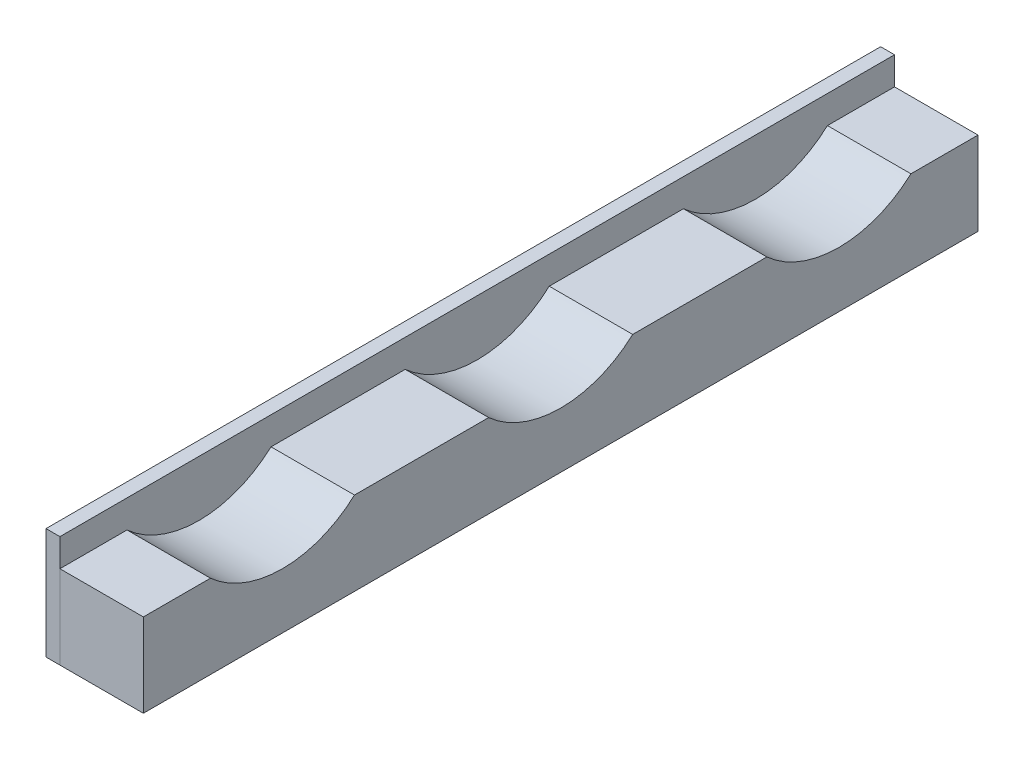
ISO-10303-21;
HEADER;
FILE_DESCRIPTION(('STEP AP214'),'2;1');
FILE_NAME('part.step','',(''),(''),'','','');
FILE_SCHEMA(('AUTOMOTIVE_DESIGN { 1 0 10303 214 1 1 1 1 }'));
ENDSEC;
DATA;
#1=APPLICATION_CONTEXT('core data for automotive mechanical design processes');
#2=APPLICATION_PROTOCOL_DEFINITION('international standard','automotive_design',2000,#1);
#3=PRODUCT_CONTEXT('',#1,'mechanical');
#4=PRODUCT('Part','Part','',(#3));
#5=PRODUCT_RELATED_PRODUCT_CATEGORY('part','',(#4));
#6=PRODUCT_DEFINITION_FORMATION('','',#4);
#7=PRODUCT_DEFINITION_CONTEXT('part definition',#1,'design');
#8=PRODUCT_DEFINITION('design','',#6,#7);
#9=PRODUCT_DEFINITION_SHAPE('','',#8);
#10=(LENGTH_UNIT() NAMED_UNIT(*) SI_UNIT(.MILLI.,.METRE.));
#11=(NAMED_UNIT(*) PLANE_ANGLE_UNIT() SI_UNIT($,.RADIAN.));
#12=(NAMED_UNIT(*) SI_UNIT($,.STERADIAN.) SOLID_ANGLE_UNIT());
#13=UNCERTAINTY_MEASURE_WITH_UNIT(LENGTH_MEASURE(1.E-05),#10,'distance_accuracy_value','');
#14=(GEOMETRIC_REPRESENTATION_CONTEXT(3) GLOBAL_UNCERTAINTY_ASSIGNED_CONTEXT((#13)) GLOBAL_UNIT_ASSIGNED_CONTEXT((#10,
#11,#12)) REPRESENTATION_CONTEXT('',''));
#15=CARTESIAN_POINT('',(0.,0.,0.));
#16=DIRECTION('',(0.,0.,1.));
#17=DIRECTION('',(1.,0.,0.));
#18=AXIS2_PLACEMENT_3D('',#15,#16,#17);
#19=CARTESIAN_POINT('',(22.,69.99,0.00999999999999446));
#20=DIRECTION('',(1.,0.,0.));
#21=DIRECTION('',(0.,0.,-1.));
#22=AXIS2_PLACEMENT_3D('',#19,#20,#21);
#23=PLANE('',#22);
#24=DIRECTION('',(0.,0.,-1.));
#25=VECTOR('',#24,1.);
#26=CARTESIAN_POINT('',(22.,100.,-99.9999999999997));
#27=LINE('',#26,#25);
#28=CARTESIAN_POINT('',(22.,100.,-75.8843582110894));
#29=VERTEX_POINT('',#28);
#30=CARTESIAN_POINT('',(22.,100.,-124.11564178891));
#31=VERTEX_POINT('',#30);
#32=EDGE_CURVE('P0_E104',#29,#31,#27,.T.);
#33=ORIENTED_EDGE('',*,*,#32,.F.);
#34=CARTESIAN_POINT('',(22.,128.5,-49.9999999999999));
#35=DIRECTION('',(1.,0.,0.));
#36=DIRECTION('',(0.,1.,0.));
#37=AXIS2_PLACEMENT_3D('',#34,#35,#36);
#38=CIRCLE('',#37,38.5);
#39=CARTESIAN_POINT('',(22.,100.,-24.1156417889104));
#40=VERTEX_POINT('',#39);
#41=EDGE_CURVE('P0_E21',#40,#29,#38,.T.);
#42=ORIENTED_EDGE('',*,*,#41,.F.);
#43=DIRECTION('',(0.,0.,-1.));
#44=VECTOR('',#43,1.);
#45=CARTESIAN_POINT('',(22.,100.,-12.0578208944552));
#46=LINE('',#45,#44);
#47=CARTESIAN_POINT('',(22.,100.,0.));
#48=VERTEX_POINT('',#47);
#49=EDGE_CURVE('P0_E90',#48,#40,#46,.T.);
#50=ORIENTED_EDGE('',*,*,#49,.F.);
#51=DIRECTION('',(0.,1.,0.));
#52=VECTOR('',#51,1.);
#53=CARTESIAN_POINT('',(22.,85.,0.));
#54=LINE('',#53,#52);
#55=CARTESIAN_POINT('',(22.,70.,0.));
#56=VERTEX_POINT('',#55);
#57=EDGE_CURVE('P0_E124',#56,#48,#54,.T.);
#58=ORIENTED_EDGE('',*,*,#57,.F.);
#59=DIRECTION('',(0.,0.,1.));
#60=VECTOR('',#59,1.);
#61=CARTESIAN_POINT('',(22.,70.,-150.));
#62=LINE('',#61,#60);
#63=CARTESIAN_POINT('',(22.,70.,-300.));
#64=VERTEX_POINT('',#63);
#65=EDGE_CURVE('P0_E137',#64,#56,#62,.T.);
#66=ORIENTED_EDGE('',*,*,#65,.F.);
#67=DIRECTION('',(0.,-1.,0.));
#68=VECTOR('',#67,1.);
#69=CARTESIAN_POINT('',(22.,85.,-300.));
#70=LINE('',#69,#68);
#71=CARTESIAN_POINT('',(22.,100.,-300.));
#72=VERTEX_POINT('',#71);
#73=EDGE_CURVE('P0_E151',#72,#64,#70,.T.);
#74=ORIENTED_EDGE('',*,*,#73,.F.);
#75=DIRECTION('',(0.,0.,-1.));
#76=VECTOR('',#75,1.);
#77=CARTESIAN_POINT('',(22.,100.,-287.942179105545));
#78=LINE('',#77,#76);
#79=CARTESIAN_POINT('',(22.,100.,-275.88435821109));
#80=VERTEX_POINT('',#79);
#81=EDGE_CURVE('P0_E158',#80,#72,#78,.T.);
#82=ORIENTED_EDGE('',*,*,#81,.F.);
#83=CARTESIAN_POINT('',(22.,128.500000000001,-250.));
#84=DIRECTION('',(1.,0.,0.));
#85=DIRECTION('',(0.,0.,-1.));
#86=AXIS2_PLACEMENT_3D('',#83,#84,#85);
#87=CIRCLE('',#86,38.5000000000009);
#88=CARTESIAN_POINT('',(22.,100.,-224.11564178891));
#89=VERTEX_POINT('',#88);
#90=EDGE_CURVE('P0_E177',#89,#80,#87,.T.);
#91=ORIENTED_EDGE('',*,*,#90,.F.);
#92=DIRECTION('',(0.,0.,-1.));
#93=VECTOR('',#92,1.);
#94=CARTESIAN_POINT('',(22.,100.,-200.));
#95=LINE('',#94,#93);
#96=CARTESIAN_POINT('',(22.,100.,-175.88435821109));
#97=VERTEX_POINT('',#96);
#98=EDGE_CURVE('P0_E163',#97,#89,#95,.T.);
#99=ORIENTED_EDGE('',*,*,#98,.F.);
#100=CARTESIAN_POINT('',(22.,128.500000000001,-150.));
#101=DIRECTION('',(1.,0.,0.));
#102=DIRECTION('',(0.,0.,-1.));
#103=AXIS2_PLACEMENT_3D('',#100,#101,#102);
#104=CIRCLE('',#103,38.500000000001);
#105=EDGE_CURVE('P0_E106',#31,#97,#104,.T.);
#106=ORIENTED_EDGE('',*,*,#105,.F.);
#107=EDGE_LOOP('',(#33,#42,#50,#58,#66,#74,#82,#91,#99,#106));
#108=FACE_BOUND('',#107,.T.);
#109=ADVANCED_FACE('P0_F17',(#108),#23,.T.);
#110=CARTESIAN_POINT('',(-8.01,100.,-24.1256417889104));
#111=DIRECTION('',(0.,1.,0.));
#112=DIRECTION('',(0.,0.,1.));
#113=AXIS2_PLACEMENT_3D('',#110,#111,#112);
#114=PLANE('',#113);
#115=DIRECTION('',(1.,0.,0.));
#116=VECTOR('',#115,1.);
#117=CARTESIAN_POINT('',(7.,100.,-24.1156417889104));
#118=LINE('',#117,#116);
#119=CARTESIAN_POINT('',(-8.,100.,-24.1156417889104));
#120=VERTEX_POINT('',#119);
#121=EDGE_CURVE('P0_E101',#120,#40,#118,.T.);
#122=ORIENTED_EDGE('',*,*,#121,.F.);
#123=DIRECTION('',(0.,0.,-1.));
#124=VECTOR('',#123,1.);
#125=CARTESIAN_POINT('',(-8.,100.,-150.));
#126=LINE('',#125,#124);
#127=CARTESIAN_POINT('',(-8.,100.,0.));
#128=VERTEX_POINT('',#127);
#129=EDGE_CURVE('P0_E123',#128,#120,#126,.T.);
#130=ORIENTED_EDGE('',*,*,#129,.F.);
#131=DIRECTION('',(-1.,0.,0.));
#132=VECTOR('',#131,1.);
#133=CARTESIAN_POINT('',(7.,100.,0.));
#134=LINE('',#133,#132);
#135=EDGE_CURVE('P0_E120',#48,#128,#134,.T.);
#136=ORIENTED_EDGE('',*,*,#135,.F.);
#137=ORIENTED_EDGE('',*,*,#49,.T.);
#138=EDGE_LOOP('',(#122,#130,#136,#137));
#139=FACE_BOUND('',#138,.T.);
#140=ADVANCED_FACE('P0_F304',(#139),#114,.T.);
#141=CARTESIAN_POINT('',(-8.,128.5,-49.9999999999999));
#142=DIRECTION('',(1.,0.,0.));
#143=DIRECTION('',(0.,1.,0.));
#144=AXIS2_PLACEMENT_3D('',#141,#142,#143);
#145=CYLINDRICAL_SURFACE('',#144,38.5);
#146=DIRECTION('',(1.,0.,0.));
#147=VECTOR('',#146,1.);
#148=CARTESIAN_POINT('',(7.,100.,-75.8843582110895));
#149=LINE('',#148,#147);
#150=CARTESIAN_POINT('',(-8.,100.,-75.8843582110894));
#151=VERTEX_POINT('',#150);
#152=EDGE_CURVE('P0_E99',#151,#29,#149,.T.);
#153=ORIENTED_EDGE('',*,*,#152,.F.);
#154=CARTESIAN_POINT('',(-8.,128.5,-49.9999999999999));
#155=DIRECTION('',(1.,0.,0.));
#156=DIRECTION('',(0.,1.,0.));
#157=AXIS2_PLACEMENT_3D('',#154,#155,#156);
#158=CIRCLE('',#157,38.5);
#159=EDGE_CURVE('P0_E175',#120,#151,#158,.T.);
#160=ORIENTED_EDGE('',*,*,#159,.F.);
#161=ORIENTED_EDGE('',*,*,#121,.T.);
#162=ORIENTED_EDGE('',*,*,#41,.T.);
#163=EDGE_LOOP('',(#153,#160,#161,#162));
#164=FACE_BOUND('',#163,.T.);
#165=ADVANCED_FACE('P0_F96',(#164),#145,.F.);
#166=CARTESIAN_POINT('',(-8.01,100.,-124.12564178891));
#167=DIRECTION('',(0.,1.,0.));
#168=DIRECTION('',(0.,0.,1.));
#169=AXIS2_PLACEMENT_3D('',#166,#167,#168);
#170=PLANE('',#169);
#171=DIRECTION('',(1.,0.,0.));
#172=VECTOR('',#171,1.);
#173=CARTESIAN_POINT('',(7.,100.,-124.11564178891));
#174=LINE('',#173,#172);
#175=CARTESIAN_POINT('',(-8.,100.,-124.11564178891));
#176=VERTEX_POINT('',#175);
#177=EDGE_CURVE('P0_E109',#176,#31,#174,.T.);
#178=ORIENTED_EDGE('',*,*,#177,.F.);
#179=DIRECTION('',(0.,0.,-1.));
#180=VECTOR('',#179,1.);
#181=CARTESIAN_POINT('',(-8.,100.,-150.));
#182=LINE('',#181,#180);
#183=EDGE_CURVE('P0_E113',#151,#176,#182,.T.);
#184=ORIENTED_EDGE('',*,*,#183,.F.);
#185=ORIENTED_EDGE('',*,*,#152,.T.);
#186=ORIENTED_EDGE('',*,*,#32,.T.);
#187=EDGE_LOOP('',(#178,#184,#185,#186));
#188=FACE_BOUND('',#187,.T.);
#189=ADVANCED_FACE('P0_F111',(#188),#170,.T.);
#190=CARTESIAN_POINT('',(-8.,128.500000000001,-150.));
#191=DIRECTION('',(1.,0.,0.));
#192=DIRECTION('',(0.,0.,-1.));
#193=AXIS2_PLACEMENT_3D('',#190,#191,#192);
#194=CYLINDRICAL_SURFACE('',#193,38.500000000001);
#195=DIRECTION('',(1.,0.,0.));
#196=VECTOR('',#195,1.);
#197=CARTESIAN_POINT('',(7.,100.,-175.88435821109));
#198=LINE('',#197,#196);
#199=CARTESIAN_POINT('',(-8.,100.,-175.88435821109));
#200=VERTEX_POINT('',#199);
#201=EDGE_CURVE('P0_E165',#200,#97,#198,.T.);
#202=ORIENTED_EDGE('',*,*,#201,.F.);
#203=CARTESIAN_POINT('',(-8.,128.500000000001,-150.));
#204=DIRECTION('',(1.,0.,0.));
#205=DIRECTION('',(0.,0.,-1.));
#206=AXIS2_PLACEMENT_3D('',#203,#204,#205);
#207=CIRCLE('',#206,38.500000000001);
#208=EDGE_CURVE('P0_E172',#176,#200,#207,.T.);
#209=ORIENTED_EDGE('',*,*,#208,.F.);
#210=ORIENTED_EDGE('',*,*,#177,.T.);
#211=ORIENTED_EDGE('',*,*,#105,.T.);
#212=EDGE_LOOP('',(#202,#209,#210,#211));
#213=FACE_BOUND('',#212,.T.);
#214=ADVANCED_FACE('P0_F181',(#213),#194,.F.);
#215=CARTESIAN_POINT('',(-8.01,100.,-224.12564178891));
#216=DIRECTION('',(0.,1.,0.));
#217=DIRECTION('',(0.,0.,1.));
#218=AXIS2_PLACEMENT_3D('',#215,#216,#217);
#219=PLANE('',#218);
#220=DIRECTION('',(1.,0.,0.));
#221=VECTOR('',#220,1.);
#222=CARTESIAN_POINT('',(7.,100.,-224.11564178891));
#223=LINE('',#222,#221);
#224=CARTESIAN_POINT('',(-8.,100.,-224.11564178891));
#225=VERTEX_POINT('',#224);
#226=EDGE_CURVE('P0_E164',#225,#89,#223,.T.);
#227=ORIENTED_EDGE('',*,*,#226,.F.);
#228=DIRECTION('',(0.,0.,-1.));
#229=VECTOR('',#228,1.);
#230=CARTESIAN_POINT('',(-8.,100.,-150.));
#231=LINE('',#230,#229);
#232=EDGE_CURVE('P0_E171',#200,#225,#231,.T.);
#233=ORIENTED_EDGE('',*,*,#232,.F.);
#234=ORIENTED_EDGE('',*,*,#201,.T.);
#235=ORIENTED_EDGE('',*,*,#98,.T.);
#236=EDGE_LOOP('',(#227,#233,#234,#235));
#237=FACE_BOUND('',#236,.T.);
#238=ADVANCED_FACE('P0_F210',(#237),#219,.T.);
#239=CARTESIAN_POINT('',(-8.,128.500000000001,-250.));
#240=DIRECTION('',(1.,0.,0.));
#241=DIRECTION('',(0.,0.,-1.));
#242=AXIS2_PLACEMENT_3D('',#239,#240,#241);
#243=CYLINDRICAL_SURFACE('',#242,38.5000000000009);
#244=DIRECTION('',(1.,0.,0.));
#245=VECTOR('',#244,1.);
#246=CARTESIAN_POINT('',(7.,100.,-275.88435821109));
#247=LINE('',#246,#245);
#248=CARTESIAN_POINT('',(-8.,100.,-275.88435821109));
#249=VERTEX_POINT('',#248);
#250=EDGE_CURVE('P0_E160',#249,#80,#247,.T.);
#251=ORIENTED_EDGE('',*,*,#250,.F.);
#252=CARTESIAN_POINT('',(-8.,128.500000000001,-250.));
#253=DIRECTION('',(1.,0.,0.));
#254=DIRECTION('',(0.,0.,-1.));
#255=AXIS2_PLACEMENT_3D('',#252,#253,#254);
#256=CIRCLE('',#255,38.5000000000009);
#257=EDGE_CURVE('P0_E167',#225,#249,#256,.T.);
#258=ORIENTED_EDGE('',*,*,#257,.F.);
#259=ORIENTED_EDGE('',*,*,#226,.T.);
#260=ORIENTED_EDGE('',*,*,#90,.T.);
#261=EDGE_LOOP('',(#251,#258,#259,#260));
#262=FACE_BOUND('',#261,.T.);
#263=ADVANCED_FACE('P0_F206',(#262),#243,.F.);
#264=CARTESIAN_POINT('',(-8.01,100.,-300.01));
#265=DIRECTION('',(0.,1.,0.));
#266=DIRECTION('',(0.,0.,1.));
#267=AXIS2_PLACEMENT_3D('',#264,#265,#266);
#268=PLANE('',#267);
#269=DIRECTION('',(1.,0.,0.));
#270=VECTOR('',#269,1.);
#271=CARTESIAN_POINT('',(7.,100.,-300.));
#272=LINE('',#271,#270);
#273=CARTESIAN_POINT('',(-8.,100.,-300.));
#274=VERTEX_POINT('',#273);
#275=EDGE_CURVE('P0_E155',#274,#72,#272,.T.);
#276=ORIENTED_EDGE('',*,*,#275,.F.);
#277=DIRECTION('',(0.,0.,-1.));
#278=VECTOR('',#277,1.);
#279=CARTESIAN_POINT('',(-8.,100.,-150.));
#280=LINE('',#279,#278);
#281=EDGE_CURVE('P0_E170',#249,#274,#280,.T.);
#282=ORIENTED_EDGE('',*,*,#281,.F.);
#283=ORIENTED_EDGE('',*,*,#250,.T.);
#284=ORIENTED_EDGE('',*,*,#81,.T.);
#285=EDGE_LOOP('',(#276,#282,#283,#284));
#286=FACE_BOUND('',#285,.T.);
#287=ADVANCED_FACE('P0_F215',(#286),#268,.T.);
#288=CARTESIAN_POINT('',(-8.01,69.99,-300.));
#289=DIRECTION('',(0.,0.,-1.));
#290=DIRECTION('',(0.,1.,0.));
#291=AXIS2_PLACEMENT_3D('',#288,#289,#290);
#292=PLANE('',#291);
#293=DIRECTION('',(1.,0.,0.));
#294=VECTOR('',#293,1.);
#295=CARTESIAN_POINT('',(7.,70.,-300.));
#296=LINE('',#295,#294);
#297=CARTESIAN_POINT('',(-8.,70.,-300.));
#298=VERTEX_POINT('',#297);
#299=EDGE_CURVE('P0_E141',#298,#64,#296,.T.);
#300=ORIENTED_EDGE('',*,*,#299,.F.);
#301=DIRECTION('',(0.,-1.,0.));
#302=VECTOR('',#301,1.);
#303=CARTESIAN_POINT('',(-8.,85.,-300.));
#304=LINE('',#303,#302);
#305=EDGE_CURVE('P0_E146',#274,#298,#304,.T.);
#306=ORIENTED_EDGE('',*,*,#305,.F.);
#307=ORIENTED_EDGE('',*,*,#275,.T.);
#308=ORIENTED_EDGE('',*,*,#73,.T.);
#309=EDGE_LOOP('',(#300,#306,#307,#308));
#310=FACE_BOUND('',#309,.T.);
#311=ADVANCED_FACE('P0_F221',(#310),#292,.T.);
#312=CARTESIAN_POINT('',(-8.01,70.,0.01));
#313=DIRECTION('',(0.,-1.,0.));
#314=DIRECTION('',(0.,0.,-1.));
#315=AXIS2_PLACEMENT_3D('',#312,#313,#314);
#316=PLANE('',#315);
#317=DIRECTION('',(1.,0.,0.));
#318=VECTOR('',#317,1.);
#319=CARTESIAN_POINT('',(7.,70.,0.));
#320=LINE('',#319,#318);
#321=CARTESIAN_POINT('',(-8.,70.,0.));
#322=VERTEX_POINT('',#321);
#323=EDGE_CURVE('P0_E36',#322,#56,#320,.T.);
#324=ORIENTED_EDGE('',*,*,#323,.F.);
#325=DIRECTION('',(0.,0.,1.));
#326=VECTOR('',#325,1.);
#327=CARTESIAN_POINT('',(-8.,70.,-150.));
#328=LINE('',#327,#326);
#329=EDGE_CURVE('P0_E27',#298,#322,#328,.T.);
#330=ORIENTED_EDGE('',*,*,#329,.F.);
#331=ORIENTED_EDGE('',*,*,#299,.T.);
#332=ORIENTED_EDGE('',*,*,#65,.T.);
#333=EDGE_LOOP('',(#324,#330,#331,#332));
#334=FACE_BOUND('',#333,.T.);
#335=ADVANCED_FACE('P0_F222',(#334),#316,.T.);
#336=CARTESIAN_POINT('',(-8.01,100.01,0.));
#337=DIRECTION('',(0.,0.,1.));
#338=DIRECTION('',(0.,-1.,0.));
#339=AXIS2_PLACEMENT_3D('',#336,#337,#338);
#340=PLANE('',#339);
#341=ORIENTED_EDGE('',*,*,#135,.T.);
#342=DIRECTION('',(0.,1.,0.));
#343=VECTOR('',#342,1.);
#344=CARTESIAN_POINT('',(-8.,85.,0.));
#345=LINE('',#344,#343);
#346=EDGE_CURVE('P0_E11',#322,#128,#345,.T.);
#347=ORIENTED_EDGE('',*,*,#346,.F.);
#348=ORIENTED_EDGE('',*,*,#323,.T.);
#349=ORIENTED_EDGE('',*,*,#57,.T.);
#350=EDGE_LOOP('',(#341,#347,#348,#349));
#351=FACE_BOUND('',#350,.T.);
#352=ADVANCED_FACE('P0_F224',(#351),#340,.T.);
#353=CARTESIAN_POINT('',(-8.,69.99,-300.01));
#354=DIRECTION('',(-1.,0.,0.));
#355=DIRECTION('',(0.,0.,1.));
#356=AXIS2_PLACEMENT_3D('',#353,#354,#355);
#357=PLANE('',#356);
#358=ORIENTED_EDGE('',*,*,#329,.T.);
#359=ORIENTED_EDGE('',*,*,#346,.T.);
#360=ORIENTED_EDGE('',*,*,#129,.T.);
#361=ORIENTED_EDGE('',*,*,#159,.T.);
#362=ORIENTED_EDGE('',*,*,#183,.T.);
#363=ORIENTED_EDGE('',*,*,#208,.T.);
#364=ORIENTED_EDGE('',*,*,#232,.T.);
#365=ORIENTED_EDGE('',*,*,#257,.T.);
#366=ORIENTED_EDGE('',*,*,#281,.T.);
#367=ORIENTED_EDGE('',*,*,#305,.T.);
#368=EDGE_LOOP('',(#358,#359,#360,#361,#362,#363,#364,#365,#366,#367));
#369=FACE_BOUND('',#368,.T.);
#370=ADVANCED_FACE('P0_F19',(#369),#357,.T.);
#371=CLOSED_SHELL('',(#109,#140,#165,#189,#214,#238,#263,#287,#311,#335,#352,#370));
#372=MANIFOLD_SOLID_BREP('P0_B1',#371);
#373=CARTESIAN_POINT('',(-7.99,110.,0.01));
#374=DIRECTION('',(0.,1.,0.));
#375=DIRECTION('',(0.,0.,-1.));
#376=AXIS2_PLACEMENT_3D('',#373,#374,#375);
#377=PLANE('',#376);
#378=DIRECTION('',(0.,0.,-1.));
#379=VECTOR('',#378,1.);
#380=CARTESIAN_POINT('',(-13.,110.,-150.));
#381=LINE('',#380,#379);
#382=CARTESIAN_POINT('',(-13.,110.,0.));
#383=VERTEX_POINT('',#382);
#384=CARTESIAN_POINT('',(-13.,110.,-300.));
#385=VERTEX_POINT('',#384);
#386=EDGE_CURVE('P1_E69',#383,#385,#381,.T.);
#387=ORIENTED_EDGE('',*,*,#386,.F.);
#388=DIRECTION('',(-1.,0.,0.));
#389=VECTOR('',#388,1.);
#390=CARTESIAN_POINT('',(-10.5,110.,0.));
#391=LINE('',#390,#389);
#392=CARTESIAN_POINT('',(-8.,110.,0.));
#393=VERTEX_POINT('',#392);
#394=EDGE_CURVE('P1_E56',#393,#383,#391,.T.);
#395=ORIENTED_EDGE('',*,*,#394,.F.);
#396=DIRECTION('',(0.,0.,1.));
#397=VECTOR('',#396,1.);
#398=CARTESIAN_POINT('',(-8.,110.,-150.));
#399=LINE('',#398,#397);
#400=CARTESIAN_POINT('',(-8.,110.,-300.));
#401=VERTEX_POINT('',#400);
#402=EDGE_CURVE('P1_E21',#401,#393,#399,.T.);
#403=ORIENTED_EDGE('',*,*,#402,.F.);
#404=DIRECTION('',(1.,0.,0.));
#405=VECTOR('',#404,1.);
#406=CARTESIAN_POINT('',(-10.5,110.,-300.));
#407=LINE('',#406,#405);
#408=EDGE_CURVE('P1_E82',#385,#401,#407,.T.);
#409=ORIENTED_EDGE('',*,*,#408,.F.);
#410=EDGE_LOOP('',(#387,#395,#403,#409));
#411=FACE_BOUND('',#410,.T.);
#412=ADVANCED_FACE('P1_F17',(#411),#377,.T.);
#413=CARTESIAN_POINT('',(-8.,69.99,0.00999999999999446));
#414=DIRECTION('',(1.,0.,0.));
#415=DIRECTION('',(0.,0.,-1.));
#416=AXIS2_PLACEMENT_3D('',#413,#414,#415);
#417=PLANE('',#416);
#418=DIRECTION('',(0.,-1.,0.));
#419=VECTOR('',#418,1.);
#420=CARTESIAN_POINT('',(-8.,90.,-300.));
#421=LINE('',#420,#419);
#422=CARTESIAN_POINT('',(-8.,70.,-300.));
#423=VERTEX_POINT('',#422);
#424=EDGE_CURVE('P1_E65',#401,#423,#421,.T.);
#425=ORIENTED_EDGE('',*,*,#424,.F.);
#426=ORIENTED_EDGE('',*,*,#402,.T.);
#427=DIRECTION('',(0.,1.,0.));
#428=VECTOR('',#427,1.);
#429=CARTESIAN_POINT('',(-8.,90.,0.));
#430=LINE('',#429,#428);
#431=CARTESIAN_POINT('',(-8.,70.,0.));
#432=VERTEX_POINT('',#431);
#433=EDGE_CURVE('P1_E62',#432,#393,#430,.T.);
#434=ORIENTED_EDGE('',*,*,#433,.F.);
#435=DIRECTION('',(0.,0.,1.));
#436=VECTOR('',#435,1.);
#437=CARTESIAN_POINT('',(-8.,70.,-150.));
#438=LINE('',#437,#436);
#439=EDGE_CURVE('P1_E84',#423,#432,#438,.T.);
#440=ORIENTED_EDGE('',*,*,#439,.F.);
#441=EDGE_LOOP('',(#425,#426,#434,#440));
#442=FACE_BOUND('',#441,.T.);
#443=ADVANCED_FACE('P1_F61',(#442),#417,.T.);
#444=CARTESIAN_POINT('',(-7.99,69.99,0.));
#445=DIRECTION('',(0.,0.,1.));
#446=DIRECTION('',(0.,1.,0.));
#447=AXIS2_PLACEMENT_3D('',#444,#445,#446);
#448=PLANE('',#447);
#449=DIRECTION('',(0.,1.,0.));
#450=VECTOR('',#449,1.);
#451=CARTESIAN_POINT('',(-13.,90.,0.));
#452=LINE('',#451,#450);
#453=CARTESIAN_POINT('',(-13.,70.,0.));
#454=VERTEX_POINT('',#453);
#455=EDGE_CURVE('P1_E71',#454,#383,#452,.T.);
#456=ORIENTED_EDGE('',*,*,#455,.F.);
#457=DIRECTION('',(-1.,0.,0.));
#458=VECTOR('',#457,1.);
#459=CARTESIAN_POINT('',(-10.5,70.,0.));
#460=LINE('',#459,#458);
#461=EDGE_CURVE('P1_E75',#432,#454,#460,.T.);
#462=ORIENTED_EDGE('',*,*,#461,.F.);
#463=ORIENTED_EDGE('',*,*,#433,.T.);
#464=ORIENTED_EDGE('',*,*,#394,.T.);
#465=EDGE_LOOP('',(#456,#462,#463,#464));
#466=FACE_BOUND('',#465,.T.);
#467=ADVANCED_FACE('P1_F73',(#466),#448,.T.);
#468=CARTESIAN_POINT('',(-13.,69.99,-300.01));
#469=DIRECTION('',(-1.,0.,0.));
#470=DIRECTION('',(0.,0.,1.));
#471=AXIS2_PLACEMENT_3D('',#468,#469,#470);
#472=PLANE('',#471);
#473=DIRECTION('',(0.,1.,0.));
#474=VECTOR('',#473,1.);
#475=CARTESIAN_POINT('',(-13.,90.,-300.));
#476=LINE('',#475,#474);
#477=CARTESIAN_POINT('',(-13.,70.,-300.));
#478=VERTEX_POINT('',#477);
#479=EDGE_CURVE('P1_E36',#478,#385,#476,.T.);
#480=ORIENTED_EDGE('',*,*,#479,.F.);
#481=DIRECTION('',(0.,0.,-1.));
#482=VECTOR('',#481,1.);
#483=CARTESIAN_POINT('',(-13.,70.,-150.));
#484=LINE('',#483,#482);
#485=EDGE_CURVE('P1_E27',#454,#478,#484,.T.);
#486=ORIENTED_EDGE('',*,*,#485,.F.);
#487=ORIENTED_EDGE('',*,*,#455,.T.);
#488=ORIENTED_EDGE('',*,*,#386,.T.);
#489=EDGE_LOOP('',(#480,#486,#487,#488));
#490=FACE_BOUND('',#489,.T.);
#491=ADVANCED_FACE('P1_F89',(#490),#472,.T.);
#492=CARTESIAN_POINT('',(-7.99,110.01,-300.));
#493=DIRECTION('',(0.,0.,-1.));
#494=DIRECTION('',(0.,-1.,0.));
#495=AXIS2_PLACEMENT_3D('',#492,#493,#494);
#496=PLANE('',#495);
#497=ORIENTED_EDGE('',*,*,#479,.T.);
#498=ORIENTED_EDGE('',*,*,#408,.T.);
#499=ORIENTED_EDGE('',*,*,#424,.T.);
#500=DIRECTION('',(1.,0.,0.));
#501=VECTOR('',#500,1.);
#502=CARTESIAN_POINT('',(-10.5,70.,-300.));
#503=LINE('',#502,#501);
#504=EDGE_CURVE('P1_E11',#478,#423,#503,.T.);
#505=ORIENTED_EDGE('',*,*,#504,.F.);
#506=EDGE_LOOP('',(#497,#498,#499,#505));
#507=FACE_BOUND('',#506,.T.);
#508=ADVANCED_FACE('P1_F91',(#507),#496,.T.);
#509=CARTESIAN_POINT('',(-7.99,70.,-300.01));
#510=DIRECTION('',(0.,-1.,0.));
#511=DIRECTION('',(0.,0.,1.));
#512=AXIS2_PLACEMENT_3D('',#509,#510,#511);
#513=PLANE('',#512);
#514=ORIENTED_EDGE('',*,*,#485,.T.);
#515=ORIENTED_EDGE('',*,*,#504,.T.);
#516=ORIENTED_EDGE('',*,*,#439,.T.);
#517=ORIENTED_EDGE('',*,*,#461,.T.);
#518=EDGE_LOOP('',(#514,#515,#516,#517));
#519=FACE_BOUND('',#518,.T.);
#520=ADVANCED_FACE('P1_F19',(#519),#513,.T.);
#521=CLOSED_SHELL('',(#412,#443,#467,#491,#508,#520));
#522=MANIFOLD_SOLID_BREP('P1_B1',#521);
#523=ADVANCED_BREP_SHAPE_REPRESENTATION('',(#18,#372,#522),#14);
#524=SHAPE_DEFINITION_REPRESENTATION(#9,#523);
ENDSEC;
END-ISO-10303-21;
